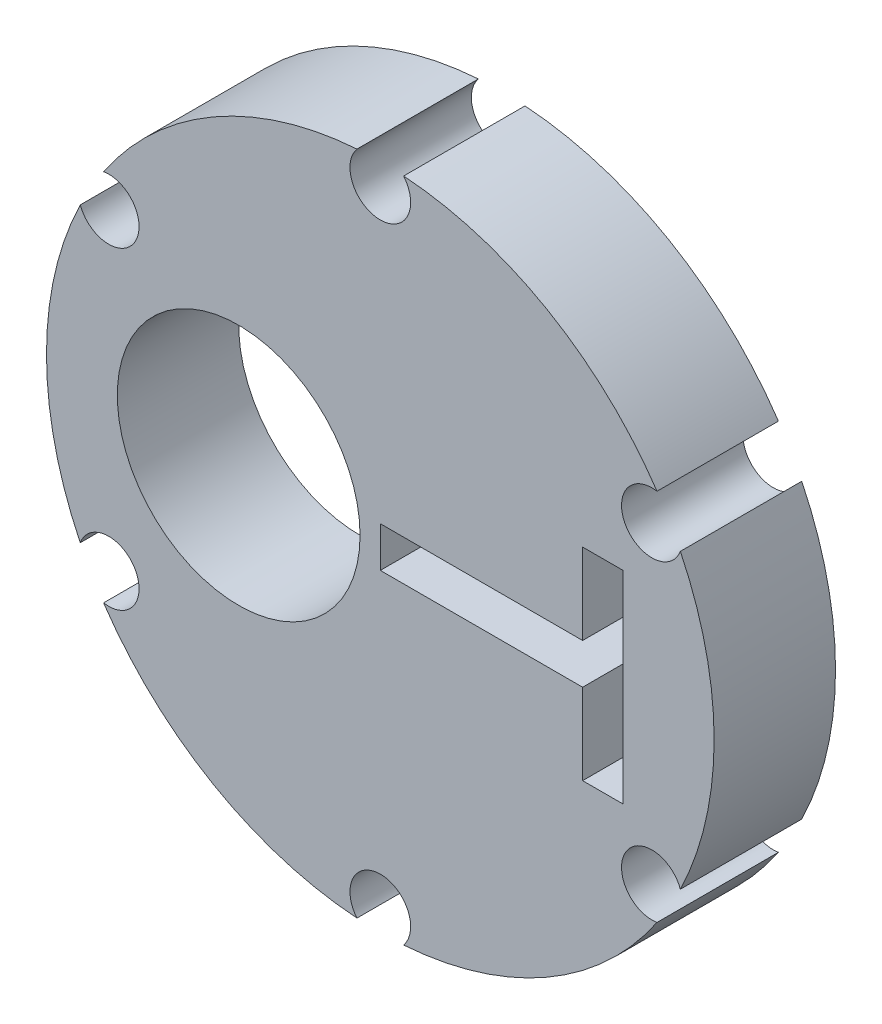
ISO-10303-21;
HEADER;
FILE_DESCRIPTION(('STEP AP214'),'2;1');
FILE_NAME('part.step','',(''),(''),'','','');
FILE_SCHEMA(('AUTOMOTIVE_DESIGN { 1 0 10303 214 1 1 1 1 }'));
ENDSEC;
DATA;
#1=APPLICATION_CONTEXT('core data for automotive mechanical design processes');
#2=APPLICATION_PROTOCOL_DEFINITION('international standard','automotive_design',2000,#1);
#3=PRODUCT_CONTEXT('',#1,'mechanical');
#4=PRODUCT('Part','Part','',(#3));
#5=PRODUCT_RELATED_PRODUCT_CATEGORY('part','',(#4));
#6=PRODUCT_DEFINITION_FORMATION('','',#4);
#7=PRODUCT_DEFINITION_CONTEXT('part definition',#1,'design');
#8=PRODUCT_DEFINITION('design','',#6,#7);
#9=PRODUCT_DEFINITION_SHAPE('','',#8);
#10=(LENGTH_UNIT() NAMED_UNIT(*) SI_UNIT(.MILLI.,.METRE.));
#11=(NAMED_UNIT(*) PLANE_ANGLE_UNIT() SI_UNIT($,.RADIAN.));
#12=(NAMED_UNIT(*) SI_UNIT($,.STERADIAN.) SOLID_ANGLE_UNIT());
#13=UNCERTAINTY_MEASURE_WITH_UNIT(LENGTH_MEASURE(1.E-05),#10,'distance_accuracy_value','');
#14=(GEOMETRIC_REPRESENTATION_CONTEXT(3) GLOBAL_UNCERTAINTY_ASSIGNED_CONTEXT((#13)) GLOBAL_UNIT_ASSIGNED_CONTEXT((#10,
#11,#12)) REPRESENTATION_CONTEXT('',''));
#15=CARTESIAN_POINT('',(0.,0.,0.));
#16=DIRECTION('',(0.,0.,1.));
#17=DIRECTION('',(1.,0.,0.));
#18=AXIS2_PLACEMENT_3D('',#15,#16,#17);
#19=CARTESIAN_POINT('',(0.,0.,6.));
#20=DIRECTION('',(0.,0.,-1.));
#21=DIRECTION('',(-1.,0.,0.));
#22=AXIS2_PLACEMENT_3D('',#19,#20,#21);
#23=CYLINDRICAL_SURFACE('',#22,16.5);
#24=CARTESIAN_POINT('',(0.,0.,0.));
#25=DIRECTION('',(0.,0.,1.));
#26=DIRECTION('',(1.,0.,0.));
#27=AXIS2_PLACEMENT_3D('',#24,#25,#26);
#28=CIRCLE('',#27,16.5);
#29=CARTESIAN_POINT('',(14.8309142694271,-7.23145780136368,0.));
#30=VERTEX_POINT('',#29);
#31=CARTESIAN_POINT('',(14.8309142694271,7.23145780136372,0.));
#32=VERTEX_POINT('',#31);
#33=EDGE_CURVE('E330',#30,#32,#28,.T.);
#34=ORIENTED_EDGE('',*,*,#33,.T.);
#35=DIRECTION('',(0.,0.,1.));
#36=VECTOR('',#35,1.);
#37=CARTESIAN_POINT('',(14.8309142694271,7.23145780136372,3.));
#38=LINE('',#37,#36);
#39=CARTESIAN_POINT('',(14.8309142694271,7.23145780136372,6.));
#40=VERTEX_POINT('',#39);
#41=EDGE_CURVE('E287',#32,#40,#38,.T.);
#42=ORIENTED_EDGE('',*,*,#41,.T.);
#43=CARTESIAN_POINT('',(0.,0.,6.));
#44=DIRECTION('',(0.,0.,1.));
#45=DIRECTION('',(1.,0.,0.));
#46=AXIS2_PLACEMENT_3D('',#43,#44,#45);
#47=CIRCLE('',#46,16.5);
#48=CARTESIAN_POINT('',(14.8309142694271,-7.23145780136368,6.));
#49=VERTEX_POINT('',#48);
#50=EDGE_CURVE('E351',#49,#40,#47,.T.);
#51=ORIENTED_EDGE('',*,*,#50,.F.);
#52=DIRECTION('',(0.,0.,1.));
#53=VECTOR('',#52,1.);
#54=CARTESIAN_POINT('',(14.8309142694271,-7.23145780136368,3.));
#55=LINE('',#54,#53);
#56=EDGE_CURVE('E278',#49,#30,#55,.F.);
#57=ORIENTED_EDGE('',*,*,#56,.T.);
#58=EDGE_LOOP('',(#34,#42,#51,#57));
#59=FACE_BOUND('',#58,.T.);
#60=ADVANCED_FACE('F33',(#59),#23,.T.);
#61=CARTESIAN_POINT('',(1.15283097233743,-16.4596774193548,0.));
#62=VERTEX_POINT('',#61);
#63=CARTESIAN_POINT('',(13.6780832970897,-9.22821961799116,0.));
#64=VERTEX_POINT('',#63);
#65=EDGE_CURVE('E327',#62,#64,#28,.T.);
#66=ORIENTED_EDGE('',*,*,#65,.T.);
#67=DIRECTION('',(0.,0.,1.));
#68=VECTOR('',#67,1.);
#69=CARTESIAN_POINT('',(13.6780832970897,-9.22821961799114,3.));
#70=LINE('',#69,#68);
#71=CARTESIAN_POINT('',(13.6780832970897,-9.22821961799114,6.));
#72=VERTEX_POINT('',#71);
#73=EDGE_CURVE('E281',#64,#72,#70,.T.);
#74=ORIENTED_EDGE('',*,*,#73,.T.);
#75=CARTESIAN_POINT('',(1.15283097233743,-16.4596774193548,6.));
#76=VERTEX_POINT('',#75);
#77=EDGE_CURVE('E352',#76,#72,#47,.T.);
#78=ORIENTED_EDGE('',*,*,#77,.F.);
#79=DIRECTION('',(0.,0.,1.));
#80=VECTOR('',#79,1.);
#81=CARTESIAN_POINT('',(1.15283097233743,-16.4596774193548,3.));
#82=LINE('',#81,#80);
#83=EDGE_CURVE('E272',#76,#62,#82,.F.);
#84=ORIENTED_EDGE('',*,*,#83,.T.);
#85=EDGE_LOOP('',(#66,#74,#78,#84));
#86=FACE_BOUND('',#85,.T.);
#87=ADVANCED_FACE('F375',(#86),#23,.T.);
#88=CARTESIAN_POINT('',(-13.6780832970896,-9.22821961799115,0.));
#89=VERTEX_POINT('',#88);
#90=CARTESIAN_POINT('',(-1.15283097233744,-16.4596774193548,0.));
#91=VERTEX_POINT('',#90);
#92=EDGE_CURVE('E321',#89,#91,#28,.T.);
#93=ORIENTED_EDGE('',*,*,#92,.T.);
#94=DIRECTION('',(0.,0.,1.));
#95=VECTOR('',#94,1.);
#96=CARTESIAN_POINT('',(-1.15283097233743,-16.4596774193548,3.));
#97=LINE('',#96,#95);
#98=CARTESIAN_POINT('',(-1.15283097233743,-16.4596774193548,6.));
#99=VERTEX_POINT('',#98);
#100=EDGE_CURVE('E275',#91,#99,#97,.T.);
#101=ORIENTED_EDGE('',*,*,#100,.T.);
#102=CARTESIAN_POINT('',(-13.6780832970896,-9.22821961799115,6.));
#103=VERTEX_POINT('',#102);
#104=EDGE_CURVE('E356',#103,#99,#47,.T.);
#105=ORIENTED_EDGE('',*,*,#104,.F.);
#106=DIRECTION('',(0.,0.,1.));
#107=VECTOR('',#106,1.);
#108=CARTESIAN_POINT('',(-13.6780832970896,-9.22821961799115,3.));
#109=LINE('',#108,#107);
#110=EDGE_CURVE('E266',#103,#89,#109,.F.);
#111=ORIENTED_EDGE('',*,*,#110,.T.);
#112=EDGE_LOOP('',(#93,#101,#105,#111));
#113=FACE_BOUND('',#112,.T.);
#114=ADVANCED_FACE('F379',(#113),#23,.T.);
#115=CARTESIAN_POINT('',(-14.8309142694271,7.23145780136367,0.));
#116=VERTEX_POINT('',#115);
#117=CARTESIAN_POINT('',(-14.8309142694271,-7.23145780136368,0.));
#118=VERTEX_POINT('',#117);
#119=EDGE_CURVE('E309',#116,#118,#28,.T.);
#120=ORIENTED_EDGE('',*,*,#119,.T.);
#121=DIRECTION('',(0.,0.,1.));
#122=VECTOR('',#121,1.);
#123=CARTESIAN_POINT('',(-14.8309142694271,-7.23145780136369,3.));
#124=LINE('',#123,#122);
#125=CARTESIAN_POINT('',(-14.8309142694271,-7.23145780136369,6.));
#126=VERTEX_POINT('',#125);
#127=EDGE_CURVE('E269',#118,#126,#124,.T.);
#128=ORIENTED_EDGE('',*,*,#127,.T.);
#129=CARTESIAN_POINT('',(-14.8309142694271,7.23145780136367,6.));
#130=VERTEX_POINT('',#129);
#131=EDGE_CURVE('E304',#130,#126,#47,.T.);
#132=ORIENTED_EDGE('',*,*,#131,.F.);
#133=DIRECTION('',(0.,0.,1.));
#134=VECTOR('',#133,1.);
#135=CARTESIAN_POINT('',(-14.8309142694271,7.23145780136367,3.));
#136=LINE('',#135,#134);
#137=EDGE_CURVE('E248',#130,#116,#136,.F.);
#138=ORIENTED_EDGE('',*,*,#137,.T.);
#139=EDGE_LOOP('',(#120,#128,#132,#138));
#140=FACE_BOUND('',#139,.T.);
#141=ADVANCED_FACE('F324',(#140),#23,.T.);
#142=CARTESIAN_POINT('',(-1.15283097233743,16.4596774193548,0.));
#143=VERTEX_POINT('',#142);
#144=CARTESIAN_POINT('',(-13.6780832970897,9.22821961799115,0.));
#145=VERTEX_POINT('',#144);
#146=EDGE_CURVE('E306',#143,#145,#28,.T.);
#147=ORIENTED_EDGE('',*,*,#146,.T.);
#148=DIRECTION('',(0.,0.,1.));
#149=VECTOR('',#148,1.);
#150=CARTESIAN_POINT('',(-13.6780832970897,9.22821961799113,3.));
#151=LINE('',#150,#149);
#152=CARTESIAN_POINT('',(-13.6780832970897,9.22821961799113,6.));
#153=VERTEX_POINT('',#152);
#154=EDGE_CURVE('E263',#145,#153,#151,.T.);
#155=ORIENTED_EDGE('',*,*,#154,.T.);
#156=CARTESIAN_POINT('',(-1.15283097233743,16.4596774193548,6.));
#157=VERTEX_POINT('',#156);
#158=EDGE_CURVE('E300',#157,#153,#47,.T.);
#159=ORIENTED_EDGE('',*,*,#158,.F.);
#160=DIRECTION('',(0.,0.,1.));
#161=VECTOR('',#160,1.);
#162=CARTESIAN_POINT('',(-1.15283097233743,16.4596774193548,3.));
#163=LINE('',#162,#161);
#164=EDGE_CURVE('E293',#157,#143,#163,.F.);
#165=ORIENTED_EDGE('',*,*,#164,.T.);
#166=EDGE_LOOP('',(#147,#155,#159,#165));
#167=FACE_BOUND('',#166,.T.);
#168=ADVANCED_FACE('F344',(#167),#23,.T.);
#169=CARTESIAN_POINT('',(13.6780832970897,9.22821961799114,6.));
#170=VERTEX_POINT('',#169);
#171=CARTESIAN_POINT('',(1.15283097233743,16.4596774193548,6.));
#172=VERTEX_POINT('',#171);
#173=EDGE_CURVE('E305',#170,#172,#47,.T.);
#174=ORIENTED_EDGE('',*,*,#173,.F.);
#175=DIRECTION('',(0.,0.,1.));
#176=VECTOR('',#175,1.);
#177=CARTESIAN_POINT('',(13.6780832970897,9.22821961799114,3.));
#178=LINE('',#177,#176);
#179=CARTESIAN_POINT('',(13.6780832970897,9.22821961799114,0.));
#180=VERTEX_POINT('',#179);
#181=EDGE_CURVE('E284',#170,#180,#178,.F.);
#182=ORIENTED_EDGE('',*,*,#181,.T.);
#183=CARTESIAN_POINT('',(1.15283097233744,16.4596774193548,0.));
#184=VERTEX_POINT('',#183);
#185=EDGE_CURVE('E299',#180,#184,#28,.T.);
#186=ORIENTED_EDGE('',*,*,#185,.T.);
#187=DIRECTION('',(0.,0.,1.));
#188=VECTOR('',#187,1.);
#189=CARTESIAN_POINT('',(1.15283097233743,16.4596774193548,3.));
#190=LINE('',#189,#188);
#191=EDGE_CURVE('E296',#184,#172,#190,.T.);
#192=ORIENTED_EDGE('',*,*,#191,.T.);
#193=EDGE_LOOP('',(#174,#182,#186,#192));
#194=FACE_BOUND('',#193,.T.);
#195=ADVANCED_FACE('F35',(#194),#23,.T.);
#196=CARTESIAN_POINT('',(0.,0.,6.));
#197=DIRECTION('',(0.,0.,1.));
#198=DIRECTION('',(1.,0.,0.));
#199=AXIS2_PLACEMENT_3D('',#196,#197,#198);
#200=PLANE('',#199);
#201=DIRECTION('',(0.,1.,0.));
#202=VECTOR('',#201,1.);
#203=CARTESIAN_POINT('',(12.,5.,6.));
#204=LINE('',#203,#202);
#205=CARTESIAN_POINT('',(12.,-5.,6.));
#206=VERTEX_POINT('',#205);
#207=CARTESIAN_POINT('',(12.,5.,6.));
#208=VERTEX_POINT('',#207);
#209=EDGE_CURVE('E48',#206,#208,#204,.T.);
#210=ORIENTED_EDGE('',*,*,#209,.F.);
#211=DIRECTION('',(1.,0.,0.));
#212=VECTOR('',#211,1.);
#213=CARTESIAN_POINT('',(12.,-5.,6.));
#214=LINE('',#213,#212);
#215=CARTESIAN_POINT('',(10.,-5.,6.));
#216=VERTEX_POINT('',#215);
#217=EDGE_CURVE('E189',#216,#206,#214,.T.);
#218=ORIENTED_EDGE('',*,*,#217,.F.);
#219=DIRECTION('',(0.,-1.,0.));
#220=VECTOR('',#219,1.);
#221=CARTESIAN_POINT('',(10.,-0.999999999999998,6.));
#222=LINE('',#221,#220);
#223=CARTESIAN_POINT('',(10.,-0.999999999999998,6.));
#224=VERTEX_POINT('',#223);
#225=EDGE_CURVE('E192',#224,#216,#222,.T.);
#226=ORIENTED_EDGE('',*,*,#225,.F.);
#227=DIRECTION('',(1.,0.,0.));
#228=VECTOR('',#227,1.);
#229=CARTESIAN_POINT('',(0.,-0.999999999999998,6.));
#230=LINE('',#229,#228);
#231=CARTESIAN_POINT('',(0.,-0.999999999999998,6.));
#232=VERTEX_POINT('',#231);
#233=EDGE_CURVE('E220',#232,#224,#230,.T.);
#234=ORIENTED_EDGE('',*,*,#233,.F.);
#235=DIRECTION('',(0.,-1.,0.));
#236=VECTOR('',#235,1.);
#237=CARTESIAN_POINT('',(0.,0.999999999999998,6.));
#238=LINE('',#237,#236);
#239=CARTESIAN_POINT('',(0.,0.999999999999998,6.));
#240=VERTEX_POINT('',#239);
#241=EDGE_CURVE('E217',#240,#232,#238,.T.);
#242=ORIENTED_EDGE('',*,*,#241,.F.);
#243=DIRECTION('',(-1.,0.,0.));
#244=VECTOR('',#243,1.);
#245=CARTESIAN_POINT('',(0.,0.999999999999998,6.));
#246=LINE('',#245,#244);
#247=CARTESIAN_POINT('',(10.,0.999999999999998,6.));
#248=VERTEX_POINT('',#247);
#249=EDGE_CURVE('E214',#248,#240,#246,.T.);
#250=ORIENTED_EDGE('',*,*,#249,.F.);
#251=DIRECTION('',(0.,-1.,0.));
#252=VECTOR('',#251,1.);
#253=CARTESIAN_POINT('',(10.,5.,6.));
#254=LINE('',#253,#252);
#255=CARTESIAN_POINT('',(10.,5.,6.));
#256=VERTEX_POINT('',#255);
#257=EDGE_CURVE('E211',#256,#248,#254,.T.);
#258=ORIENTED_EDGE('',*,*,#257,.F.);
#259=DIRECTION('',(-1.,0.,0.));
#260=VECTOR('',#259,1.);
#261=CARTESIAN_POINT('',(12.,5.,6.));
#262=LINE('',#261,#260);
#263=EDGE_CURVE('E209',#208,#256,#262,.T.);
#264=ORIENTED_EDGE('',*,*,#263,.F.);
#265=EDGE_LOOP('',(#210,#218,#226,#234,#242,#250,#258,#264));
#266=FACE_BOUND('',#265,.T.);
#267=CARTESIAN_POINT('',(-7.,0.,6.));
#268=DIRECTION('',(0.,0.,1.));
#269=DIRECTION('',(1.,0.,0.));
#270=AXIS2_PLACEMENT_3D('',#267,#268,#269);
#271=CIRCLE('',#270,6.);
#272=CARTESIAN_POINT('',(-0.999999999999999,0.,6.));
#273=VERTEX_POINT('',#272);
#274=EDGE_CURVE('E227',#273,#273,#271,.T.);
#275=ORIENTED_EDGE('',*,*,#274,.F.);
#276=EDGE_LOOP('',(#275));
#277=FACE_BOUND('',#276,.T.);
#278=CARTESIAN_POINT('',(13.4233937586588,7.75,6.));
#279=DIRECTION('',(0.,0.,1.));
#280=DIRECTION('',(1.,0.,0.));
#281=AXIS2_PLACEMENT_3D('',#278,#279,#280);
#282=CIRCLE('',#281,1.5);
#283=EDGE_CURVE('E249',#170,#40,#282,.T.);
#284=ORIENTED_EDGE('',*,*,#283,.F.);
#285=ORIENTED_EDGE('',*,*,#173,.T.);
#286=CARTESIAN_POINT('',(0.,15.5,6.));
#287=DIRECTION('',(0.,0.,1.));
#288=DIRECTION('',(1.,0.,0.));
#289=AXIS2_PLACEMENT_3D('',#286,#287,#288);
#290=CIRCLE('',#289,1.5);
#291=EDGE_CURVE('E290',#157,#172,#290,.T.);
#292=ORIENTED_EDGE('',*,*,#291,.F.);
#293=ORIENTED_EDGE('',*,*,#158,.T.);
#294=CARTESIAN_POINT('',(-13.4233937586588,7.74999999999999,6.));
#295=DIRECTION('',(0.,0.,1.));
#296=DIRECTION('',(1.,0.,0.));
#297=AXIS2_PLACEMENT_3D('',#294,#295,#296);
#298=CIRCLE('',#297,1.5);
#299=EDGE_CURVE('E242',#130,#153,#298,.T.);
#300=ORIENTED_EDGE('',*,*,#299,.F.);
#301=ORIENTED_EDGE('',*,*,#131,.T.);
#302=CARTESIAN_POINT('',(-13.4233937586588,-7.75000000000001,6.));
#303=DIRECTION('',(0.,0.,1.));
#304=DIRECTION('',(1.,0.,0.));
#305=AXIS2_PLACEMENT_3D('',#302,#303,#304);
#306=CIRCLE('',#305,1.5);
#307=EDGE_CURVE('E258',#103,#126,#306,.T.);
#308=ORIENTED_EDGE('',*,*,#307,.F.);
#309=ORIENTED_EDGE('',*,*,#104,.T.);
#310=CARTESIAN_POINT('',(0.,-15.5,6.));
#311=DIRECTION('',(0.,0.,1.));
#312=DIRECTION('',(1.,0.,0.));
#313=AXIS2_PLACEMENT_3D('',#310,#311,#312);
#314=CIRCLE('',#313,1.5);
#315=EDGE_CURVE('E256',#76,#99,#314,.T.);
#316=ORIENTED_EDGE('',*,*,#315,.F.);
#317=ORIENTED_EDGE('',*,*,#77,.T.);
#318=CARTESIAN_POINT('',(13.4233937586588,-7.75,6.));
#319=DIRECTION('',(0.,0.,1.));
#320=DIRECTION('',(1.,0.,0.));
#321=AXIS2_PLACEMENT_3D('',#318,#319,#320);
#322=CIRCLE('',#321,1.5);
#323=EDGE_CURVE('E254',#49,#72,#322,.T.);
#324=ORIENTED_EDGE('',*,*,#323,.F.);
#325=ORIENTED_EDGE('',*,*,#50,.T.);
#326=EDGE_LOOP('',(#284,#285,#292,#293,#300,#301,#308,#309,#316,#317,#324,#325));
#327=FACE_BOUND('',#326,.T.);
#328=ADVANCED_FACE('F348',(#266,#277,#327),#200,.T.);
#329=CARTESIAN_POINT('',(0.,0.,0.));
#330=DIRECTION('',(0.,0.,1.));
#331=DIRECTION('',(1.,0.,0.));
#332=AXIS2_PLACEMENT_3D('',#329,#330,#331);
#333=PLANE('',#332);
#334=DIRECTION('',(1.,0.,0.));
#335=VECTOR('',#334,1.);
#336=CARTESIAN_POINT('',(12.,-5.,0.));
#337=LINE('',#336,#335);
#338=CARTESIAN_POINT('',(10.,-5.,0.));
#339=VERTEX_POINT('',#338);
#340=CARTESIAN_POINT('',(12.,-5.,0.));
#341=VERTEX_POINT('',#340);
#342=EDGE_CURVE('E178',#339,#341,#337,.T.);
#343=ORIENTED_EDGE('',*,*,#342,.T.);
#344=DIRECTION('',(0.,1.,0.));
#345=VECTOR('',#344,1.);
#346=CARTESIAN_POINT('',(12.,5.,0.));
#347=LINE('',#346,#345);
#348=CARTESIAN_POINT('',(12.,5.,0.));
#349=VERTEX_POINT('',#348);
#350=EDGE_CURVE('E172',#341,#349,#347,.T.);
#351=ORIENTED_EDGE('',*,*,#350,.T.);
#352=DIRECTION('',(-1.,0.,0.));
#353=VECTOR('',#352,1.);
#354=CARTESIAN_POINT('',(12.,5.,0.));
#355=LINE('',#354,#353);
#356=CARTESIAN_POINT('',(10.,5.,0.));
#357=VERTEX_POINT('',#356);
#358=EDGE_CURVE('E181',#349,#357,#355,.T.);
#359=ORIENTED_EDGE('',*,*,#358,.T.);
#360=DIRECTION('',(0.,-1.,0.));
#361=VECTOR('',#360,1.);
#362=CARTESIAN_POINT('',(10.,5.,0.));
#363=LINE('',#362,#361);
#364=CARTESIAN_POINT('',(10.,0.999999999999998,0.));
#365=VERTEX_POINT('',#364);
#366=EDGE_CURVE('E56',#357,#365,#363,.T.);
#367=ORIENTED_EDGE('',*,*,#366,.T.);
#368=DIRECTION('',(-1.,0.,0.));
#369=VECTOR('',#368,1.);
#370=CARTESIAN_POINT('',(0.,0.999999999999998,0.));
#371=LINE('',#370,#369);
#372=CARTESIAN_POINT('',(0.,0.999999999999998,0.));
#373=VERTEX_POINT('',#372);
#374=EDGE_CURVE('E196',#365,#373,#371,.T.);
#375=ORIENTED_EDGE('',*,*,#374,.T.);
#376=DIRECTION('',(0.,-1.,0.));
#377=VECTOR('',#376,1.);
#378=CARTESIAN_POINT('',(0.,0.999999999999998,0.));
#379=LINE('',#378,#377);
#380=CARTESIAN_POINT('',(0.,-0.999999999999998,0.));
#381=VERTEX_POINT('',#380);
#382=EDGE_CURVE('E199',#373,#381,#379,.T.);
#383=ORIENTED_EDGE('',*,*,#382,.T.);
#384=DIRECTION('',(1.,0.,0.));
#385=VECTOR('',#384,1.);
#386=CARTESIAN_POINT('',(0.,-0.999999999999998,0.));
#387=LINE('',#386,#385);
#388=CARTESIAN_POINT('',(10.,-0.999999999999998,0.));
#389=VERTEX_POINT('',#388);
#390=EDGE_CURVE('E202',#381,#389,#387,.T.);
#391=ORIENTED_EDGE('',*,*,#390,.T.);
#392=DIRECTION('',(0.,-1.,0.));
#393=VECTOR('',#392,1.);
#394=CARTESIAN_POINT('',(10.,-0.999999999999998,0.));
#395=LINE('',#394,#393);
#396=EDGE_CURVE('E205',#389,#339,#395,.T.);
#397=ORIENTED_EDGE('',*,*,#396,.T.);
#398=EDGE_LOOP('',(#343,#351,#359,#367,#375,#383,#391,#397));
#399=FACE_BOUND('',#398,.T.);
#400=CARTESIAN_POINT('',(-7.,0.,0.));
#401=DIRECTION('',(0.,0.,1.));
#402=DIRECTION('',(1.,0.,0.));
#403=AXIS2_PLACEMENT_3D('',#400,#401,#402);
#404=CIRCLE('',#403,6.);
#405=CARTESIAN_POINT('',(-0.999999999999999,0.,0.));
#406=VERTEX_POINT('',#405);
#407=EDGE_CURVE('E239',#406,#406,#404,.T.);
#408=ORIENTED_EDGE('',*,*,#407,.T.);
#409=EDGE_LOOP('',(#408));
#410=FACE_BOUND('',#409,.T.);
#411=ORIENTED_EDGE('',*,*,#185,.F.);
#412=CARTESIAN_POINT('',(13.4233937586588,7.75,0.));
#413=DIRECTION('',(0.,0.,1.));
#414=DIRECTION('',(1.,0.,0.));
#415=AXIS2_PLACEMENT_3D('',#412,#413,#414);
#416=CIRCLE('',#415,1.5);
#417=EDGE_CURVE('E245',#180,#32,#416,.T.);
#418=ORIENTED_EDGE('',*,*,#417,.T.);
#419=ORIENTED_EDGE('',*,*,#33,.F.);
#420=CARTESIAN_POINT('',(13.4233937586588,-7.75,0.));
#421=DIRECTION('',(0.,0.,1.));
#422=DIRECTION('',(1.,0.,0.));
#423=AXIS2_PLACEMENT_3D('',#420,#421,#422);
#424=CIRCLE('',#423,1.5);
#425=EDGE_CURVE('E251',#30,#64,#424,.T.);
#426=ORIENTED_EDGE('',*,*,#425,.T.);
#427=ORIENTED_EDGE('',*,*,#65,.F.);
#428=CARTESIAN_POINT('',(0.,-15.5,0.));
#429=DIRECTION('',(0.,0.,1.));
#430=DIRECTION('',(1.,0.,0.));
#431=AXIS2_PLACEMENT_3D('',#428,#429,#430);
#432=CIRCLE('',#431,1.5);
#433=EDGE_CURVE('E11',#62,#91,#432,.T.);
#434=ORIENTED_EDGE('',*,*,#433,.T.);
#435=ORIENTED_EDGE('',*,*,#92,.F.);
#436=CARTESIAN_POINT('',(-13.4233937586588,-7.75000000000001,0.));
#437=DIRECTION('',(0.,0.,1.));
#438=DIRECTION('',(1.,0.,0.));
#439=AXIS2_PLACEMENT_3D('',#436,#437,#438);
#440=CIRCLE('',#439,1.5);
#441=EDGE_CURVE('E41',#89,#118,#440,.T.);
#442=ORIENTED_EDGE('',*,*,#441,.T.);
#443=ORIENTED_EDGE('',*,*,#119,.F.);
#444=CARTESIAN_POINT('',(-13.4233937586588,7.74999999999999,0.));
#445=DIRECTION('',(0.,0.,1.));
#446=DIRECTION('',(1.,0.,0.));
#447=AXIS2_PLACEMENT_3D('',#444,#445,#446);
#448=CIRCLE('',#447,1.5);
#449=EDGE_CURVE('E312',#116,#145,#448,.T.);
#450=ORIENTED_EDGE('',*,*,#449,.T.);
#451=ORIENTED_EDGE('',*,*,#146,.F.);
#452=CARTESIAN_POINT('',(0.,15.5,0.));
#453=DIRECTION('',(0.,0.,1.));
#454=DIRECTION('',(1.,0.,0.));
#455=AXIS2_PLACEMENT_3D('',#452,#453,#454);
#456=CIRCLE('',#455,1.5);
#457=EDGE_CURVE('E303',#143,#184,#456,.T.);
#458=ORIENTED_EDGE('',*,*,#457,.T.);
#459=EDGE_LOOP('',(#411,#418,#419,#426,#427,#434,#435,#442,#443,#450,#451,#458));
#460=FACE_BOUND('',#459,.T.);
#461=ADVANCED_FACE('F185',(#399,#410,#460),#333,.F.);
#462=CARTESIAN_POINT('',(0.,15.5,0.));
#463=DIRECTION('',(0.,0.,1.));
#464=DIRECTION('',(1.,0.,0.));
#465=AXIS2_PLACEMENT_3D('',#462,#463,#464);
#466=CYLINDRICAL_SURFACE('',#465,1.5);
#467=ORIENTED_EDGE('',*,*,#457,.F.);
#468=ORIENTED_EDGE('',*,*,#164,.F.);
#469=ORIENTED_EDGE('',*,*,#291,.T.);
#470=ORIENTED_EDGE('',*,*,#191,.F.);
#471=EDGE_LOOP('',(#467,#468,#469,#470));
#472=FACE_BOUND('',#471,.T.);
#473=ADVANCED_FACE('F340',(#472),#466,.F.);
#474=CARTESIAN_POINT('',(-13.4233937586588,7.74999999999999,0.));
#475=DIRECTION('',(0.,0.,1.));
#476=DIRECTION('',(1.,0.,0.));
#477=AXIS2_PLACEMENT_3D('',#474,#475,#476);
#478=CYLINDRICAL_SURFACE('',#477,1.5);
#479=ORIENTED_EDGE('',*,*,#449,.F.);
#480=ORIENTED_EDGE('',*,*,#137,.F.);
#481=ORIENTED_EDGE('',*,*,#299,.T.);
#482=ORIENTED_EDGE('',*,*,#154,.F.);
#483=EDGE_LOOP('',(#479,#480,#481,#482));
#484=FACE_BOUND('',#483,.T.);
#485=ADVANCED_FACE('F363',(#484),#478,.F.);
#486=CARTESIAN_POINT('',(-13.4233937586588,-7.75000000000001,0.));
#487=DIRECTION('',(0.,0.,1.));
#488=DIRECTION('',(1.,0.,0.));
#489=AXIS2_PLACEMENT_3D('',#486,#487,#488);
#490=CYLINDRICAL_SURFACE('',#489,1.5);
#491=ORIENTED_EDGE('',*,*,#441,.F.);
#492=ORIENTED_EDGE('',*,*,#110,.F.);
#493=ORIENTED_EDGE('',*,*,#307,.T.);
#494=ORIENTED_EDGE('',*,*,#127,.F.);
#495=EDGE_LOOP('',(#491,#492,#493,#494));
#496=FACE_BOUND('',#495,.T.);
#497=ADVANCED_FACE('F365',(#496),#490,.F.);
#498=CARTESIAN_POINT('',(0.,-15.5,0.));
#499=DIRECTION('',(0.,0.,1.));
#500=DIRECTION('',(1.,0.,0.));
#501=AXIS2_PLACEMENT_3D('',#498,#499,#500);
#502=CYLINDRICAL_SURFACE('',#501,1.5);
#503=ORIENTED_EDGE('',*,*,#433,.F.);
#504=ORIENTED_EDGE('',*,*,#83,.F.);
#505=ORIENTED_EDGE('',*,*,#315,.T.);
#506=ORIENTED_EDGE('',*,*,#100,.F.);
#507=EDGE_LOOP('',(#503,#504,#505,#506));
#508=FACE_BOUND('',#507,.T.);
#509=ADVANCED_FACE('F371',(#508),#502,.F.);
#510=CARTESIAN_POINT('',(13.4233937586588,-7.75,0.));
#511=DIRECTION('',(0.,0.,1.));
#512=DIRECTION('',(1.,0.,0.));
#513=AXIS2_PLACEMENT_3D('',#510,#511,#512);
#514=CYLINDRICAL_SURFACE('',#513,1.5);
#515=ORIENTED_EDGE('',*,*,#425,.F.);
#516=ORIENTED_EDGE('',*,*,#56,.F.);
#517=ORIENTED_EDGE('',*,*,#323,.T.);
#518=ORIENTED_EDGE('',*,*,#73,.F.);
#519=EDGE_LOOP('',(#515,#516,#517,#518));
#520=FACE_BOUND('',#519,.T.);
#521=ADVANCED_FACE('F427',(#520),#514,.F.);
#522=CARTESIAN_POINT('',(13.4233937586588,7.75,0.));
#523=DIRECTION('',(0.,0.,1.));
#524=DIRECTION('',(1.,0.,0.));
#525=AXIS2_PLACEMENT_3D('',#522,#523,#524);
#526=CYLINDRICAL_SURFACE('',#525,1.5);
#527=ORIENTED_EDGE('',*,*,#417,.F.);
#528=ORIENTED_EDGE('',*,*,#181,.F.);
#529=ORIENTED_EDGE('',*,*,#283,.T.);
#530=ORIENTED_EDGE('',*,*,#41,.F.);
#531=EDGE_LOOP('',(#527,#528,#529,#530));
#532=FACE_BOUND('',#531,.T.);
#533=ADVANCED_FACE('F436',(#532),#526,.F.);
#534=CARTESIAN_POINT('',(-7.,0.,0.));
#535=DIRECTION('',(0.,0.,1.));
#536=DIRECTION('',(1.,0.,0.));
#537=AXIS2_PLACEMENT_3D('',#534,#535,#536);
#538=CYLINDRICAL_SURFACE('',#537,6.);
#539=ORIENTED_EDGE('',*,*,#407,.F.);
#540=EDGE_LOOP('',(#539));
#541=FACE_BOUND('',#540,.T.);
#542=ORIENTED_EDGE('',*,*,#274,.T.);
#543=EDGE_LOOP('',(#542));
#544=FACE_BOUND('',#543,.T.);
#545=ADVANCED_FACE('F445',(#541,#544),#538,.F.);
#546=CARTESIAN_POINT('',(12.,5.,0.));
#547=DIRECTION('',(1.,0.,0.));
#548=DIRECTION('',(0.,0.,-1.));
#549=AXIS2_PLACEMENT_3D('',#546,#547,#548);
#550=PLANE('',#549);
#551=ORIENTED_EDGE('',*,*,#209,.T.);
#552=DIRECTION('',(0.,0.,1.));
#553=VECTOR('',#552,1.);
#554=CARTESIAN_POINT('',(12.,5.,0.));
#555=LINE('',#554,#553);
#556=EDGE_CURVE('E168',#349,#208,#555,.T.);
#557=ORIENTED_EDGE('',*,*,#556,.F.);
#558=ORIENTED_EDGE('',*,*,#350,.F.);
#559=DIRECTION('',(0.,0.,1.));
#560=VECTOR('',#559,1.);
#561=CARTESIAN_POINT('',(12.,-5.,0.));
#562=LINE('',#561,#560);
#563=EDGE_CURVE('E225',#341,#206,#562,.T.);
#564=ORIENTED_EDGE('',*,*,#563,.T.);
#565=EDGE_LOOP('',(#551,#557,#558,#564));
#566=FACE_BOUND('',#565,.T.);
#567=ADVANCED_FACE('F170',(#566),#550,.F.);
#568=CARTESIAN_POINT('',(12.,-5.,0.));
#569=DIRECTION('',(0.,-1.,0.));
#570=DIRECTION('',(0.,0.,-1.));
#571=AXIS2_PLACEMENT_3D('',#568,#569,#570);
#572=PLANE('',#571);
#573=ORIENTED_EDGE('',*,*,#217,.T.);
#574=ORIENTED_EDGE('',*,*,#563,.F.);
#575=ORIENTED_EDGE('',*,*,#342,.F.);
#576=DIRECTION('',(0.,0.,1.));
#577=VECTOR('',#576,1.);
#578=CARTESIAN_POINT('',(10.,-5.,0.));
#579=LINE('',#578,#577);
#580=EDGE_CURVE('E228',#339,#216,#579,.T.);
#581=ORIENTED_EDGE('',*,*,#580,.T.);
#582=EDGE_LOOP('',(#573,#574,#575,#581));
#583=FACE_BOUND('',#582,.T.);
#584=ADVANCED_FACE('F463',(#583),#572,.F.);
#585=CARTESIAN_POINT('',(10.,-0.999999999999998,0.));
#586=DIRECTION('',(-1.,0.,0.));
#587=DIRECTION('',(0.,-1.,0.));
#588=AXIS2_PLACEMENT_3D('',#585,#586,#587);
#589=PLANE('',#588);
#590=ORIENTED_EDGE('',*,*,#225,.T.);
#591=ORIENTED_EDGE('',*,*,#580,.F.);
#592=ORIENTED_EDGE('',*,*,#396,.F.);
#593=DIRECTION('',(0.,0.,1.));
#594=VECTOR('',#593,1.);
#595=CARTESIAN_POINT('',(10.,-0.999999999999998,0.));
#596=LINE('',#595,#594);
#597=EDGE_CURVE('E230',#389,#224,#596,.T.);
#598=ORIENTED_EDGE('',*,*,#597,.T.);
#599=EDGE_LOOP('',(#590,#591,#592,#598));
#600=FACE_BOUND('',#599,.T.);
#601=ADVANCED_FACE('F472',(#600),#589,.F.);
#602=CARTESIAN_POINT('',(0.,-0.999999999999998,0.));
#603=DIRECTION('',(0.,-1.,0.));
#604=DIRECTION('',(0.,0.,-1.));
#605=AXIS2_PLACEMENT_3D('',#602,#603,#604);
#606=PLANE('',#605);
#607=ORIENTED_EDGE('',*,*,#233,.T.);
#608=ORIENTED_EDGE('',*,*,#597,.F.);
#609=ORIENTED_EDGE('',*,*,#390,.F.);
#610=DIRECTION('',(0.,0.,1.));
#611=VECTOR('',#610,1.);
#612=CARTESIAN_POINT('',(0.,-0.999999999999998,0.));
#613=LINE('',#612,#611);
#614=EDGE_CURVE('E232',#381,#232,#613,.T.);
#615=ORIENTED_EDGE('',*,*,#614,.T.);
#616=EDGE_LOOP('',(#607,#608,#609,#615));
#617=FACE_BOUND('',#616,.T.);
#618=ADVANCED_FACE('F481',(#617),#606,.F.);
#619=CARTESIAN_POINT('',(0.,0.999999999999998,0.));
#620=DIRECTION('',(-1.,0.,0.));
#621=DIRECTION('',(0.,-1.,0.));
#622=AXIS2_PLACEMENT_3D('',#619,#620,#621);
#623=PLANE('',#622);
#624=ORIENTED_EDGE('',*,*,#241,.T.);
#625=ORIENTED_EDGE('',*,*,#614,.F.);
#626=ORIENTED_EDGE('',*,*,#382,.F.);
#627=DIRECTION('',(0.,0.,1.));
#628=VECTOR('',#627,1.);
#629=CARTESIAN_POINT('',(0.,0.999999999999998,0.));
#630=LINE('',#629,#628);
#631=EDGE_CURVE('E234',#373,#240,#630,.T.);
#632=ORIENTED_EDGE('',*,*,#631,.T.);
#633=EDGE_LOOP('',(#624,#625,#626,#632));
#634=FACE_BOUND('',#633,.T.);
#635=ADVANCED_FACE('F490',(#634),#623,.F.);
#636=CARTESIAN_POINT('',(0.,0.999999999999998,0.));
#637=DIRECTION('',(0.,1.,0.));
#638=DIRECTION('',(0.,0.,1.));
#639=AXIS2_PLACEMENT_3D('',#636,#637,#638);
#640=PLANE('',#639);
#641=ORIENTED_EDGE('',*,*,#249,.T.);
#642=ORIENTED_EDGE('',*,*,#631,.F.);
#643=ORIENTED_EDGE('',*,*,#374,.F.);
#644=DIRECTION('',(0.,0.,1.));
#645=VECTOR('',#644,1.);
#646=CARTESIAN_POINT('',(10.,0.999999999999998,0.));
#647=LINE('',#646,#645);
#648=EDGE_CURVE('E236',#365,#248,#647,.T.);
#649=ORIENTED_EDGE('',*,*,#648,.T.);
#650=EDGE_LOOP('',(#641,#642,#643,#649));
#651=FACE_BOUND('',#650,.T.);
#652=ADVANCED_FACE('F499',(#651),#640,.F.);
#653=CARTESIAN_POINT('',(10.,5.,0.));
#654=DIRECTION('',(-1.,0.,0.));
#655=DIRECTION('',(0.,-1.,0.));
#656=AXIS2_PLACEMENT_3D('',#653,#654,#655);
#657=PLANE('',#656);
#658=ORIENTED_EDGE('',*,*,#257,.T.);
#659=ORIENTED_EDGE('',*,*,#648,.F.);
#660=ORIENTED_EDGE('',*,*,#366,.F.);
#661=DIRECTION('',(0.,0.,1.));
#662=VECTOR('',#661,1.);
#663=CARTESIAN_POINT('',(10.,5.,0.));
#664=LINE('',#663,#662);
#665=EDGE_CURVE('E177',#357,#256,#664,.T.);
#666=ORIENTED_EDGE('',*,*,#665,.T.);
#667=EDGE_LOOP('',(#658,#659,#660,#666));
#668=FACE_BOUND('',#667,.T.);
#669=ADVANCED_FACE('F508',(#668),#657,.F.);
#670=CARTESIAN_POINT('',(12.,5.,0.));
#671=DIRECTION('',(0.,1.,0.));
#672=DIRECTION('',(0.,0.,1.));
#673=AXIS2_PLACEMENT_3D('',#670,#671,#672);
#674=PLANE('',#673);
#675=ORIENTED_EDGE('',*,*,#263,.T.);
#676=ORIENTED_EDGE('',*,*,#665,.F.);
#677=ORIENTED_EDGE('',*,*,#358,.F.);
#678=ORIENTED_EDGE('',*,*,#556,.T.);
#679=EDGE_LOOP('',(#675,#676,#677,#678));
#680=FACE_BOUND('',#679,.T.);
#681=ADVANCED_FACE('F182',(#680),#674,.F.);
#682=CLOSED_SHELL('',(#60,#87,#114,#141,#168,#195,#328,#461,#473,#485,#497,#509,#521,#533,#545,
#567,#584,#601,#618,#635,#652,#669,#681));
#683=MANIFOLD_SOLID_BREP('B2',#682);
#684=ADVANCED_BREP_SHAPE_REPRESENTATION('',(#18,#683),#14);
#685=SHAPE_DEFINITION_REPRESENTATION(#9,#684);
ENDSEC;
END-ISO-10303-21;
